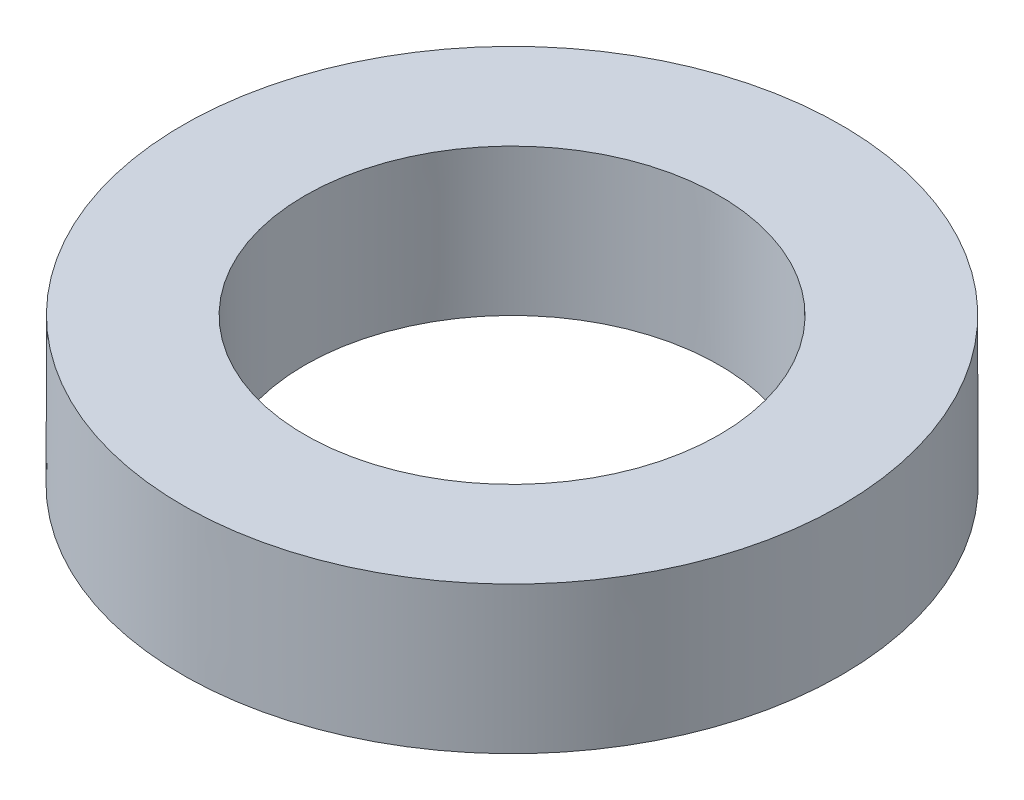
ISO-10303-21;
HEADER;
FILE_DESCRIPTION(('STEP AP214'),'2;1');
FILE_NAME('part.step','',(''),(''),'','','');
FILE_SCHEMA(('AUTOMOTIVE_DESIGN { 1 0 10303 214 1 1 1 1 }'));
ENDSEC;
DATA;
#1=APPLICATION_CONTEXT('core data for automotive mechanical design processes');
#2=APPLICATION_PROTOCOL_DEFINITION('international standard','automotive_design',2000,#1);
#3=PRODUCT_CONTEXT('',#1,'mechanical');
#4=PRODUCT('Part','Part','',(#3));
#5=PRODUCT_RELATED_PRODUCT_CATEGORY('part','',(#4));
#6=PRODUCT_DEFINITION_FORMATION('','',#4);
#7=PRODUCT_DEFINITION_CONTEXT('part definition',#1,'design');
#8=PRODUCT_DEFINITION('design','',#6,#7);
#9=PRODUCT_DEFINITION_SHAPE('','',#8);
#10=(LENGTH_UNIT() NAMED_UNIT(*) SI_UNIT(.MILLI.,.METRE.));
#11=(NAMED_UNIT(*) PLANE_ANGLE_UNIT() SI_UNIT($,.RADIAN.));
#12=(NAMED_UNIT(*) SI_UNIT($,.STERADIAN.) SOLID_ANGLE_UNIT());
#13=UNCERTAINTY_MEASURE_WITH_UNIT(LENGTH_MEASURE(1.E-05),#10,'distance_accuracy_value','');
#14=(GEOMETRIC_REPRESENTATION_CONTEXT(3) GLOBAL_UNCERTAINTY_ASSIGNED_CONTEXT((#13)) GLOBAL_UNIT_ASSIGNED_CONTEXT((#10,
#11,#12)) REPRESENTATION_CONTEXT('',''));
#15=CARTESIAN_POINT('',(0.,0.,0.));
#16=DIRECTION('',(0.,0.,1.));
#17=DIRECTION('',(1.,0.,0.));
#18=AXIS2_PLACEMENT_3D('',#15,#16,#17);
#19=CARTESIAN_POINT('',(0.000339175562287943,6.93776220288271,0.));
#20=DIRECTION('',(-4.88883233475033E-05,-0.999999998804966,0.));
#21=DIRECTION('',(0.999999998804966,-4.88883233475033E-05,0.));
#22=AXIS2_PLACEMENT_3D('',#19,#20,#21);
#23=CONICAL_SURFACE('',#22,9.79753040419389,4.88883233669529E-05);
#24=CARTESIAN_POINT('',(0.,0.,0.));
#25=DIRECTION('',(-4.88883233475033E-05,-0.999999998804966,0.));
#26=DIRECTION('',(0.999999998804966,-4.88883233475033E-05,0.));
#27=AXIS2_PLACEMENT_3D('',#24,#25,#26);
#28=CIRCLE('',#27,9.79786957975658);
#29=CARTESIAN_POINT('',(9.79786956804779,-0.000479001416128777,0.));
#30=VERTEX_POINT('',#29);
#31=EDGE_CURVE('E10',#30,#30,#28,.T.);
#32=ORIENTED_EDGE('',*,*,#31,.T.);
#33=EDGE_LOOP('',(#32));
#34=FACE_BOUND('',#33,.T.);
#35=CARTESIAN_POINT('',(0.000339175562287943,6.93776220288271,0.));
#36=DIRECTION('',(-4.88883233475033E-05,-0.999999998804966,0.));
#37=DIRECTION('',(0.999999998804966,-4.88883233475033E-05,0.));
#38=AXIS2_PLACEMENT_3D('',#35,#36,#37);
#39=CIRCLE('',#38,9.79753040419389);
#40=CARTESIAN_POINT('',(9.79786956804779,6.9372832180483,0.));
#41=VERTEX_POINT('',#40);
#42=EDGE_CURVE('E46',#41,#41,#39,.T.);
#43=ORIENTED_EDGE('',*,*,#42,.F.);
#44=EDGE_LOOP('',(#43));
#45=FACE_BOUND('',#44,.T.);
#46=ADVANCED_FACE('F31',(#34,#45),#23,.F.);
#47=CARTESIAN_POINT('',(0.,0.,0.));
#48=DIRECTION('',(4.88883233475033E-05,0.999999998804966,0.));
#49=DIRECTION('',(-0.999999998804966,4.88883233475033E-05,0.));
#50=AXIS2_PLACEMENT_3D('',#47,#48,#49);
#51=CONICAL_SURFACE('',#50,9.79786957975658,1.57074743847153);
#52=CARTESIAN_POINT('',(1.38311212931919E-08,0.000282912571542906,0.));
#53=DIRECTION('',(-4.88883233475033E-05,-0.999999998804966,0.));
#54=DIRECTION('',(0.999999998804966,-4.88883233475033E-05,0.));
#55=AXIS2_PLACEMENT_3D('',#52,#53,#54);
#56=CIRCLE('',#55,15.5847845763889);
#57=CARTESIAN_POINT('',(15.5847845715957,-0.000479001416128777,0.));
#58=VERTEX_POINT('',#57);
#59=EDGE_CURVE('E38',#58,#58,#56,.T.);
#60=ORIENTED_EDGE('',*,*,#59,.T.);
#61=EDGE_LOOP('',(#60));
#62=FACE_BOUND('',#61,.T.);
#63=ORIENTED_EDGE('',*,*,#31,.F.);
#64=EDGE_LOOP('',(#63));
#65=FACE_BOUND('',#64,.T.);
#66=ADVANCED_FACE('F56',(#62,#65),#51,.T.);
#67=CARTESIAN_POINT('',(1.38311212931919E-08,0.000282912571542906,0.));
#68=DIRECTION('',(-4.88883233475033E-05,-0.999999998804966,0.));
#69=DIRECTION('',(0.999999998804966,-4.88883233475033E-05,0.));
#70=AXIS2_PLACEMENT_3D('',#67,#68,#69);
#71=CONICAL_SURFACE('',#70,15.5847845763889,0.00190114996137942);
#72=CARTESIAN_POINT('',(0.000339189362695509,6.93804448721165,0.));
#73=DIRECTION('',(-4.88883233475033E-05,-0.999999998804966,0.));
#74=DIRECTION('',(0.999999998804966,-4.88883233475033E-05,0.));
#75=AXIS2_PLACEMENT_3D('',#72,#73,#74);
#76=CIRCLE('',#75,15.5715948353326);
#77=CARTESIAN_POINT('',(15.5719340060867,6.9372832180483,0.));
#78=VERTEX_POINT('',#77);
#79=EDGE_CURVE('E42',#78,#78,#76,.T.);
#80=ORIENTED_EDGE('',*,*,#79,.T.);
#81=EDGE_LOOP('',(#80));
#82=FACE_BOUND('',#81,.T.);
#83=ORIENTED_EDGE('',*,*,#59,.F.);
#84=EDGE_LOOP('',(#83));
#85=FACE_BOUND('',#84,.T.);
#86=ADVANCED_FACE('F60',(#82,#85),#71,.T.);
#87=CARTESIAN_POINT('',(0.000339189362695509,6.93804448721165,0.));
#88=DIRECTION('',(4.88883233475033E-05,0.999999998804966,0.));
#89=DIRECTION('',(-0.999999998804966,4.88883233475033E-05,0.));
#90=AXIS2_PLACEMENT_3D('',#87,#88,#89);
#91=CONICAL_SURFACE('',#90,15.5715948353326,1.57074743847153);
#92=ORIENTED_EDGE('',*,*,#42,.T.);
#93=EDGE_LOOP('',(#92));
#94=FACE_BOUND('',#93,.T.);
#95=ORIENTED_EDGE('',*,*,#79,.F.);
#96=EDGE_LOOP('',(#95));
#97=FACE_BOUND('',#96,.T.);
#98=ADVANCED_FACE('F52',(#94,#97),#91,.F.);
#99=CLOSED_SHELL('',(#46,#66,#86,#98));
#100=CARTESIAN_POINT('',(0.000169594681347085,3.4690222436058,0.));
#101=DIRECTION('',(-4.88883233475033E-05,-0.999999998804966,0.));
#102=DIRECTION('',(0.999999998804966,-4.88883233475033E-05,0.));
#103=AXIS2_PLACEMENT_3D('',#100,#101,#102);
#104=TOROIDAL_SURFACE('',#103,12.6847322075068,0.664224488961904);
#105=CARTESIAN_POINT('',(13.3491262751976,3.46836963549447,0.));
#106=VERTEX_POINT('',#105);
#107=VERTEX_LOOP('',#106);
#108=FACE_BOUND('',#107,.T.);
#109=ADVANCED_FACE('F70',(#108),#104,.F.);
#110=CLOSED_SHELL('',(#109));
#111=ORIENTED_CLOSED_SHELL('',*,#110,.T.);
#112=BREP_WITH_VOIDS('B2',#99,(#111));
#113=ADVANCED_BREP_SHAPE_REPRESENTATION('',(#18,#112),#14);
#114=SHAPE_DEFINITION_REPRESENTATION(#9,#113);
ENDSEC;
END-ISO-10303-21;
